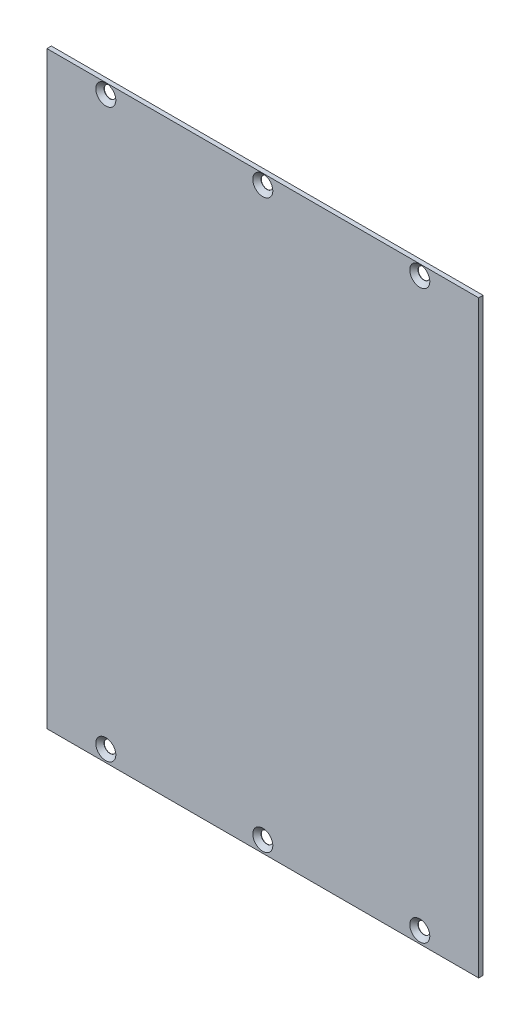
ISO-10303-21;
HEADER;
FILE_DESCRIPTION(('STEP AP214'),'2;1');
FILE_NAME('part.step','',(''),(''),'','','');
FILE_SCHEMA(('AUTOMOTIVE_DESIGN { 1 0 10303 214 1 1 1 1 }'));
ENDSEC;
DATA;
#1=APPLICATION_CONTEXT('core data for automotive mechanical design processes');
#2=APPLICATION_PROTOCOL_DEFINITION('international standard','automotive_design',2000,#1);
#3=PRODUCT_CONTEXT('',#1,'mechanical');
#4=PRODUCT('Part','Part','',(#3));
#5=PRODUCT_RELATED_PRODUCT_CATEGORY('part','',(#4));
#6=PRODUCT_DEFINITION_FORMATION('','',#4);
#7=PRODUCT_DEFINITION_CONTEXT('part definition',#1,'design');
#8=PRODUCT_DEFINITION('design','',#6,#7);
#9=PRODUCT_DEFINITION_SHAPE('','',#8);
#10=(LENGTH_UNIT() NAMED_UNIT(*) SI_UNIT(.MILLI.,.METRE.));
#11=(NAMED_UNIT(*) PLANE_ANGLE_UNIT() SI_UNIT($,.RADIAN.));
#12=(NAMED_UNIT(*) SI_UNIT($,.STERADIAN.) SOLID_ANGLE_UNIT());
#13=UNCERTAINTY_MEASURE_WITH_UNIT(LENGTH_MEASURE(1.E-05),#10,'distance_accuracy_value','');
#14=(GEOMETRIC_REPRESENTATION_CONTEXT(3) GLOBAL_UNCERTAINTY_ASSIGNED_CONTEXT((#13)) GLOBAL_UNIT_ASSIGNED_CONTEXT((#10,
#11,#12)) REPRESENTATION_CONTEXT('',''));
#15=CARTESIAN_POINT('',(0.,0.,0.));
#16=DIRECTION('',(0.,0.,1.));
#17=DIRECTION('',(1.,0.,0.));
#18=AXIS2_PLACEMENT_3D('',#15,#16,#17);
#19=CARTESIAN_POINT('',(0.,0.,1.5));
#20=DIRECTION('',(1.,0.,0.));
#21=DIRECTION('',(0.,1.,0.));
#22=AXIS2_PLACEMENT_3D('',#19,#20,#21);
#23=PLANE('',#22);
#24=DIRECTION('',(0.,-1.,0.));
#25=VECTOR('',#24,1.);
#26=CARTESIAN_POINT('',(0.,0.,0.));
#27=LINE('',#26,#25);
#28=CARTESIAN_POINT('',(0.,200.,0.));
#29=VERTEX_POINT('',#28);
#30=CARTESIAN_POINT('',(0.,0.,0.));
#31=VERTEX_POINT('',#30);
#32=EDGE_CURVE('E106',#29,#31,#27,.T.);
#33=ORIENTED_EDGE('',*,*,#32,.T.);
#34=DIRECTION('',(0.,0.,-1.));
#35=VECTOR('',#34,1.);
#36=CARTESIAN_POINT('',(0.,0.,1.5));
#37=LINE('',#36,#35);
#38=CARTESIAN_POINT('',(0.,0.,1.5));
#39=VERTEX_POINT('',#38);
#40=EDGE_CURVE('E97',#39,#31,#37,.T.);
#41=ORIENTED_EDGE('',*,*,#40,.F.);
#42=DIRECTION('',(0.,-1.,0.));
#43=VECTOR('',#42,1.);
#44=CARTESIAN_POINT('',(0.,0.,1.5));
#45=LINE('',#44,#43);
#46=CARTESIAN_POINT('',(0.,200.,1.5));
#47=VERTEX_POINT('',#46);
#48=EDGE_CURVE('E91',#47,#39,#45,.T.);
#49=ORIENTED_EDGE('',*,*,#48,.F.);
#50=DIRECTION('',(0.,0.,-1.));
#51=VECTOR('',#50,1.);
#52=CARTESIAN_POINT('',(0.,200.,1.5));
#53=LINE('',#52,#51);
#54=EDGE_CURVE('E102',#47,#29,#53,.T.);
#55=ORIENTED_EDGE('',*,*,#54,.T.);
#56=EDGE_LOOP('',(#33,#41,#49,#55));
#57=FACE_BOUND('',#56,.T.);
#58=ADVANCED_FACE('F37',(#57),#23,.F.);
#59=CARTESIAN_POINT('',(0.,0.,1.5));
#60=DIRECTION('',(0.,1.,0.));
#61=DIRECTION('',(0.,0.,1.));
#62=AXIS2_PLACEMENT_3D('',#59,#60,#61);
#63=PLANE('',#62);
#64=DIRECTION('',(1.,0.,0.));
#65=VECTOR('',#64,1.);
#66=CARTESIAN_POINT('',(0.,0.,0.));
#67=LINE('',#66,#65);
#68=CARTESIAN_POINT('',(146.6,0.,0.));
#69=VERTEX_POINT('',#68);
#70=EDGE_CURVE('E96',#31,#69,#67,.T.);
#71=ORIENTED_EDGE('',*,*,#70,.T.);
#72=DIRECTION('',(0.,0.,-1.));
#73=VECTOR('',#72,1.);
#74=CARTESIAN_POINT('',(146.6,0.,1.5));
#75=LINE('',#74,#73);
#76=CARTESIAN_POINT('',(146.6,0.,1.5));
#77=VERTEX_POINT('',#76);
#78=EDGE_CURVE('E94',#77,#69,#75,.T.);
#79=ORIENTED_EDGE('',*,*,#78,.F.);
#80=DIRECTION('',(1.,0.,0.));
#81=VECTOR('',#80,1.);
#82=CARTESIAN_POINT('',(0.,0.,1.5));
#83=LINE('',#82,#81);
#84=EDGE_CURVE('E86',#39,#77,#83,.T.);
#85=ORIENTED_EDGE('',*,*,#84,.F.);
#86=ORIENTED_EDGE('',*,*,#40,.T.);
#87=EDGE_LOOP('',(#71,#79,#85,#86));
#88=FACE_BOUND('',#87,.T.);
#89=ADVANCED_FACE('F95',(#88),#63,.F.);
#90=CARTESIAN_POINT('',(146.6,0.,1.5));
#91=DIRECTION('',(-1.,0.,0.));
#92=DIRECTION('',(0.,-1.,0.));
#93=AXIS2_PLACEMENT_3D('',#90,#91,#92);
#94=PLANE('',#93);
#95=DIRECTION('',(0.,1.,0.));
#96=VECTOR('',#95,1.);
#97=CARTESIAN_POINT('',(146.6,0.,0.));
#98=LINE('',#97,#96);
#99=CARTESIAN_POINT('',(146.6,200.,0.));
#100=VERTEX_POINT('',#99);
#101=EDGE_CURVE('E72',#69,#100,#98,.T.);
#102=ORIENTED_EDGE('',*,*,#101,.T.);
#103=DIRECTION('',(0.,0.,-1.));
#104=VECTOR('',#103,1.);
#105=CARTESIAN_POINT('',(146.6,200.,1.5));
#106=LINE('',#105,#104);
#107=CARTESIAN_POINT('',(146.6,200.,1.5));
#108=VERTEX_POINT('',#107);
#109=EDGE_CURVE('E98',#108,#100,#106,.T.);
#110=ORIENTED_EDGE('',*,*,#109,.F.);
#111=DIRECTION('',(0.,1.,0.));
#112=VECTOR('',#111,1.);
#113=CARTESIAN_POINT('',(146.6,0.,1.5));
#114=LINE('',#113,#112);
#115=EDGE_CURVE('E89',#77,#108,#114,.T.);
#116=ORIENTED_EDGE('',*,*,#115,.F.);
#117=ORIENTED_EDGE('',*,*,#78,.T.);
#118=EDGE_LOOP('',(#102,#110,#116,#117));
#119=FACE_BOUND('',#118,.T.);
#120=ADVANCED_FACE('F100',(#119),#94,.F.);
#121=CARTESIAN_POINT('',(0.,200.,1.5));
#122=DIRECTION('',(0.,-1.,0.));
#123=DIRECTION('',(0.,0.,-1.));
#124=AXIS2_PLACEMENT_3D('',#121,#122,#123);
#125=PLANE('',#124);
#126=DIRECTION('',(-1.,0.,0.));
#127=VECTOR('',#126,1.);
#128=CARTESIAN_POINT('',(0.,200.,0.));
#129=LINE('',#128,#127);
#130=EDGE_CURVE('E78',#100,#29,#129,.T.);
#131=ORIENTED_EDGE('',*,*,#130,.T.);
#132=ORIENTED_EDGE('',*,*,#54,.F.);
#133=DIRECTION('',(-1.,0.,0.));
#134=VECTOR('',#133,1.);
#135=CARTESIAN_POINT('',(0.,200.,1.5));
#136=LINE('',#135,#134);
#137=EDGE_CURVE('E55',#108,#47,#136,.T.);
#138=ORIENTED_EDGE('',*,*,#137,.F.);
#139=ORIENTED_EDGE('',*,*,#109,.T.);
#140=EDGE_LOOP('',(#131,#132,#138,#139));
#141=FACE_BOUND('',#140,.T.);
#142=ADVANCED_FACE('F257',(#141),#125,.F.);
#143=CARTESIAN_POINT('',(0.,0.,1.5));
#144=DIRECTION('',(0.,0.,-1.));
#145=DIRECTION('',(-1.,0.,0.));
#146=AXIS2_PLACEMENT_3D('',#143,#144,#145);
#147=PLANE('',#146);
#148=CARTESIAN_POINT('',(126.6,196.5,1.5));
#149=DIRECTION('',(0.,0.,-1.));
#150=DIRECTION('',(-1.,0.,0.));
#151=AXIS2_PLACEMENT_3D('',#148,#149,#150);
#152=CIRCLE('',#151,3.40000000000001);
#153=CARTESIAN_POINT('',(123.2,196.5,1.5));
#154=VERTEX_POINT('',#153);
#155=EDGE_CURVE('E134',#154,#154,#152,.T.);
#156=ORIENTED_EDGE('',*,*,#155,.T.);
#157=EDGE_LOOP('',(#156));
#158=FACE_BOUND('',#157,.T.);
#159=CARTESIAN_POINT('',(73.3,196.5,1.5));
#160=DIRECTION('',(0.,0.,-1.));
#161=DIRECTION('',(-1.,0.,0.));
#162=AXIS2_PLACEMENT_3D('',#159,#160,#161);
#163=CIRCLE('',#162,3.40000000000001);
#164=CARTESIAN_POINT('',(69.8999999999999,196.5,1.5));
#165=VERTEX_POINT('',#164);
#166=EDGE_CURVE('E131',#165,#165,#163,.T.);
#167=ORIENTED_EDGE('',*,*,#166,.T.);
#168=EDGE_LOOP('',(#167));
#169=FACE_BOUND('',#168,.T.);
#170=CARTESIAN_POINT('',(20.,196.5,1.5));
#171=DIRECTION('',(0.,0.,-1.));
#172=DIRECTION('',(-1.,0.,0.));
#173=AXIS2_PLACEMENT_3D('',#170,#171,#172);
#174=CIRCLE('',#173,3.40000000000001);
#175=CARTESIAN_POINT('',(23.4,196.5,1.5));
#176=VERTEX_POINT('',#175);
#177=EDGE_CURVE('E128',#176,#176,#174,.T.);
#178=ORIENTED_EDGE('',*,*,#177,.T.);
#179=EDGE_LOOP('',(#178));
#180=FACE_BOUND('',#179,.T.);
#181=CARTESIAN_POINT('',(126.6,4.,1.5));
#182=DIRECTION('',(0.,0.,-1.));
#183=DIRECTION('',(-1.,0.,0.));
#184=AXIS2_PLACEMENT_3D('',#181,#182,#183);
#185=CIRCLE('',#184,3.40000000000001);
#186=CARTESIAN_POINT('',(123.2,4.,1.5));
#187=VERTEX_POINT('',#186);
#188=EDGE_CURVE('E125',#187,#187,#185,.T.);
#189=ORIENTED_EDGE('',*,*,#188,.T.);
#190=EDGE_LOOP('',(#189));
#191=FACE_BOUND('',#190,.T.);
#192=CARTESIAN_POINT('',(73.3,4.,1.5));
#193=DIRECTION('',(0.,0.,-1.));
#194=DIRECTION('',(-1.,0.,0.));
#195=AXIS2_PLACEMENT_3D('',#192,#193,#194);
#196=CIRCLE('',#195,3.40000000000001);
#197=CARTESIAN_POINT('',(69.9,4.,1.5));
#198=VERTEX_POINT('',#197);
#199=EDGE_CURVE('E122',#198,#198,#196,.T.);
#200=ORIENTED_EDGE('',*,*,#199,.T.);
#201=EDGE_LOOP('',(#200));
#202=FACE_BOUND('',#201,.T.);
#203=CARTESIAN_POINT('',(20.,4.,1.5));
#204=DIRECTION('',(0.,0.,-1.));
#205=DIRECTION('',(-1.,0.,0.));
#206=AXIS2_PLACEMENT_3D('',#203,#204,#205);
#207=CIRCLE('',#206,3.40000000000001);
#208=CARTESIAN_POINT('',(16.6,4.,1.5));
#209=VERTEX_POINT('',#208);
#210=EDGE_CURVE('E119',#209,#209,#207,.T.);
#211=ORIENTED_EDGE('',*,*,#210,.T.);
#212=EDGE_LOOP('',(#211));
#213=FACE_BOUND('',#212,.T.);
#214=ORIENTED_EDGE('',*,*,#48,.T.);
#215=ORIENTED_EDGE('',*,*,#84,.T.);
#216=ORIENTED_EDGE('',*,*,#115,.T.);
#217=ORIENTED_EDGE('',*,*,#137,.T.);
#218=EDGE_LOOP('',(#214,#215,#216,#217));
#219=FACE_BOUND('',#218,.T.);
#220=ADVANCED_FACE('F87',(#158,#169,#180,#191,#202,#213,#219),#147,.F.);
#221=CARTESIAN_POINT('',(0.,0.,0.));
#222=DIRECTION('',(0.,0.,-1.));
#223=DIRECTION('',(-1.,0.,0.));
#224=AXIS2_PLACEMENT_3D('',#221,#222,#223);
#225=PLANE('',#224);
#226=CARTESIAN_POINT('',(126.6,4.,0.));
#227=DIRECTION('',(0.,0.,1.));
#228=DIRECTION('',(1.,0.,0.));
#229=AXIS2_PLACEMENT_3D('',#226,#227,#228);
#230=CIRCLE('',#229,2.00000000000002);
#231=CARTESIAN_POINT('',(128.6,4.,0.));
#232=VERTEX_POINT('',#231);
#233=EDGE_CURVE('E224',#232,#232,#230,.T.);
#234=ORIENTED_EDGE('',*,*,#233,.T.);
#235=EDGE_LOOP('',(#234));
#236=FACE_BOUND('',#235,.T.);
#237=CARTESIAN_POINT('',(73.3,196.5,0.));
#238=DIRECTION('',(0.,0.,1.));
#239=DIRECTION('',(1.,0.,0.));
#240=AXIS2_PLACEMENT_3D('',#237,#238,#239);
#241=CIRCLE('',#240,2.00000000000001);
#242=CARTESIAN_POINT('',(75.3,196.5,0.));
#243=VERTEX_POINT('',#242);
#244=EDGE_CURVE('E221',#243,#243,#241,.T.);
#245=ORIENTED_EDGE('',*,*,#244,.T.);
#246=EDGE_LOOP('',(#245));
#247=FACE_BOUND('',#246,.T.);
#248=CARTESIAN_POINT('',(73.3,4.,0.));
#249=DIRECTION('',(0.,0.,1.));
#250=DIRECTION('',(1.,0.,0.));
#251=AXIS2_PLACEMENT_3D('',#248,#249,#250);
#252=CIRCLE('',#251,2.);
#253=CARTESIAN_POINT('',(75.3,4.,0.));
#254=VERTEX_POINT('',#253);
#255=EDGE_CURVE('E216',#254,#254,#252,.T.);
#256=ORIENTED_EDGE('',*,*,#255,.T.);
#257=EDGE_LOOP('',(#256));
#258=FACE_BOUND('',#257,.T.);
#259=CARTESIAN_POINT('',(20.,196.5,0.));
#260=DIRECTION('',(0.,0.,1.));
#261=DIRECTION('',(1.,0.,0.));
#262=AXIS2_PLACEMENT_3D('',#259,#260,#261);
#263=CIRCLE('',#262,2.);
#264=CARTESIAN_POINT('',(22.,196.5,0.));
#265=VERTEX_POINT('',#264);
#266=EDGE_CURVE('E214',#265,#265,#263,.T.);
#267=ORIENTED_EDGE('',*,*,#266,.T.);
#268=EDGE_LOOP('',(#267));
#269=FACE_BOUND('',#268,.T.);
#270=CARTESIAN_POINT('',(126.6,196.5,0.));
#271=DIRECTION('',(0.,0.,1.));
#272=DIRECTION('',(1.,0.,0.));
#273=AXIS2_PLACEMENT_3D('',#270,#271,#272);
#274=CIRCLE('',#273,2.);
#275=CARTESIAN_POINT('',(128.6,196.5,0.));
#276=VERTEX_POINT('',#275);
#277=EDGE_CURVE('E227',#276,#276,#274,.T.);
#278=ORIENTED_EDGE('',*,*,#277,.T.);
#279=EDGE_LOOP('',(#278));
#280=FACE_BOUND('',#279,.T.);
#281=CARTESIAN_POINT('',(20.,4.,0.));
#282=DIRECTION('',(0.,0.,1.));
#283=DIRECTION('',(1.,0.,0.));
#284=AXIS2_PLACEMENT_3D('',#281,#282,#283);
#285=CIRCLE('',#284,2.);
#286=CARTESIAN_POINT('',(22.,4.,0.));
#287=VERTEX_POINT('',#286);
#288=EDGE_CURVE('E109',#287,#287,#285,.T.);
#289=ORIENTED_EDGE('',*,*,#288,.T.);
#290=EDGE_LOOP('',(#289));
#291=FACE_BOUND('',#290,.T.);
#292=ORIENTED_EDGE('',*,*,#32,.F.);
#293=ORIENTED_EDGE('',*,*,#130,.F.);
#294=ORIENTED_EDGE('',*,*,#101,.F.);
#295=ORIENTED_EDGE('',*,*,#70,.F.);
#296=EDGE_LOOP('',(#292,#293,#294,#295));
#297=FACE_BOUND('',#296,.T.);
#298=ADVANCED_FACE('F233',(#236,#247,#258,#269,#280,#291,#297),#225,.T.);
#299=CARTESIAN_POINT('',(20.,4.,0.));
#300=DIRECTION('',(0.,0.,1.));
#301=DIRECTION('',(1.,0.,0.));
#302=AXIS2_PLACEMENT_3D('',#299,#300,#301);
#303=CYLINDRICAL_SURFACE('',#302,2.);
#304=CARTESIAN_POINT('',(20.,4.,0.100000000000006));
#305=DIRECTION('',(0.,0.,-1.));
#306=DIRECTION('',(-1.,0.,0.));
#307=AXIS2_PLACEMENT_3D('',#304,#305,#306);
#308=CIRCLE('',#307,2.);
#309=CARTESIAN_POINT('',(18.,4.,0.100000000000006));
#310=VERTEX_POINT('',#309);
#311=EDGE_CURVE('E11',#310,#310,#308,.F.);
#312=ORIENTED_EDGE('',*,*,#311,.T.);
#313=EDGE_LOOP('',(#312));
#314=FACE_BOUND('',#313,.T.);
#315=ORIENTED_EDGE('',*,*,#288,.F.);
#316=EDGE_LOOP('',(#315));
#317=FACE_BOUND('',#316,.T.);
#318=ADVANCED_FACE('F237',(#314,#317),#303,.F.);
#319=CARTESIAN_POINT('',(126.6,196.5,0.));
#320=DIRECTION('',(0.,0.,1.));
#321=DIRECTION('',(1.,0.,0.));
#322=AXIS2_PLACEMENT_3D('',#319,#320,#321);
#323=CYLINDRICAL_SURFACE('',#322,2.);
#324=CARTESIAN_POINT('',(126.6,196.5,0.100000000000003));
#325=DIRECTION('',(0.,0.,-1.));
#326=DIRECTION('',(-1.,0.,0.));
#327=AXIS2_PLACEMENT_3D('',#324,#325,#326);
#328=CIRCLE('',#327,2.);
#329=CARTESIAN_POINT('',(124.6,196.5,0.100000000000003));
#330=VERTEX_POINT('',#329);
#331=EDGE_CURVE('E116',#330,#330,#328,.F.);
#332=ORIENTED_EDGE('',*,*,#331,.T.);
#333=EDGE_LOOP('',(#332));
#334=FACE_BOUND('',#333,.T.);
#335=ORIENTED_EDGE('',*,*,#277,.F.);
#336=EDGE_LOOP('',(#335));
#337=FACE_BOUND('',#336,.T.);
#338=ADVANCED_FACE('F210',(#334,#337),#323,.F.);
#339=CARTESIAN_POINT('',(20.,196.5,0.));
#340=DIRECTION('',(0.,0.,1.));
#341=DIRECTION('',(1.,0.,0.));
#342=AXIS2_PLACEMENT_3D('',#339,#340,#341);
#343=CYLINDRICAL_SURFACE('',#342,2.);
#344=CARTESIAN_POINT('',(20.,196.5,0.10000000000001));
#345=DIRECTION('',(0.,0.,-1.));
#346=DIRECTION('',(-1.,0.,0.));
#347=AXIS2_PLACEMENT_3D('',#344,#345,#346);
#348=CIRCLE('',#347,2.);
#349=CARTESIAN_POINT('',(22.,196.5,0.10000000000001));
#350=VERTEX_POINT('',#349);
#351=EDGE_CURVE('E140',#350,#350,#348,.F.);
#352=ORIENTED_EDGE('',*,*,#351,.T.);
#353=EDGE_LOOP('',(#352));
#354=FACE_BOUND('',#353,.T.);
#355=ORIENTED_EDGE('',*,*,#266,.F.);
#356=EDGE_LOOP('',(#355));
#357=FACE_BOUND('',#356,.T.);
#358=ADVANCED_FACE('F207',(#354,#357),#343,.F.);
#359=CARTESIAN_POINT('',(73.3,4.,0.));
#360=DIRECTION('',(0.,0.,1.));
#361=DIRECTION('',(1.,0.,0.));
#362=AXIS2_PLACEMENT_3D('',#359,#360,#361);
#363=CYLINDRICAL_SURFACE('',#362,2.);
#364=CARTESIAN_POINT('',(73.3,4.,0.100000000000003));
#365=DIRECTION('',(0.,0.,-1.));
#366=DIRECTION('',(-1.,0.,0.));
#367=AXIS2_PLACEMENT_3D('',#364,#365,#366);
#368=CIRCLE('',#367,2.);
#369=CARTESIAN_POINT('',(71.3,4.,0.100000000000003));
#370=VERTEX_POINT('',#369);
#371=EDGE_CURVE('E47',#370,#370,#368,.F.);
#372=ORIENTED_EDGE('',*,*,#371,.T.);
#373=EDGE_LOOP('',(#372));
#374=FACE_BOUND('',#373,.T.);
#375=ORIENTED_EDGE('',*,*,#255,.F.);
#376=EDGE_LOOP('',(#375));
#377=FACE_BOUND('',#376,.T.);
#378=ADVANCED_FACE('F148',(#374,#377),#363,.F.);
#379=CARTESIAN_POINT('',(73.3,196.5,0.));
#380=DIRECTION('',(0.,0.,1.));
#381=DIRECTION('',(1.,0.,0.));
#382=AXIS2_PLACEMENT_3D('',#379,#380,#381);
#383=CYLINDRICAL_SURFACE('',#382,2.00000000000001);
#384=CARTESIAN_POINT('',(73.3,196.5,0.100000000000017));
#385=DIRECTION('',(0.,0.,-1.));
#386=DIRECTION('',(-1.,0.,0.));
#387=AXIS2_PLACEMENT_3D('',#384,#385,#386);
#388=CIRCLE('',#387,2.00000000000001);
#389=CARTESIAN_POINT('',(71.2999999999999,196.5,0.100000000000017));
#390=VERTEX_POINT('',#389);
#391=EDGE_CURVE('E137',#390,#390,#388,.F.);
#392=ORIENTED_EDGE('',*,*,#391,.T.);
#393=EDGE_LOOP('',(#392));
#394=FACE_BOUND('',#393,.T.);
#395=ORIENTED_EDGE('',*,*,#244,.F.);
#396=EDGE_LOOP('',(#395));
#397=FACE_BOUND('',#396,.T.);
#398=ADVANCED_FACE('F246',(#394,#397),#383,.F.);
#399=CARTESIAN_POINT('',(126.6,4.,0.));
#400=DIRECTION('',(0.,0.,1.));
#401=DIRECTION('',(1.,0.,0.));
#402=AXIS2_PLACEMENT_3D('',#399,#400,#401);
#403=CYLINDRICAL_SURFACE('',#402,2.00000000000002);
#404=CARTESIAN_POINT('',(126.6,4.,0.100000000000029));
#405=DIRECTION('',(0.,0.,-1.));
#406=DIRECTION('',(-1.,0.,0.));
#407=AXIS2_PLACEMENT_3D('',#404,#405,#406);
#408=CIRCLE('',#407,2.00000000000002);
#409=CARTESIAN_POINT('',(124.6,4.,0.100000000000029));
#410=VERTEX_POINT('',#409);
#411=EDGE_CURVE('E143',#410,#410,#408,.F.);
#412=ORIENTED_EDGE('',*,*,#411,.T.);
#413=EDGE_LOOP('',(#412));
#414=FACE_BOUND('',#413,.T.);
#415=ORIENTED_EDGE('',*,*,#233,.F.);
#416=EDGE_LOOP('',(#415));
#417=FACE_BOUND('',#416,.T.);
#418=ADVANCED_FACE('F182',(#414,#417),#403,.F.);
#419=CARTESIAN_POINT('',(126.6,196.5,0.100000000000002));
#420=DIRECTION('',(0.,0.,1.));
#421=DIRECTION('',(1.,0.,0.));
#422=AXIS2_PLACEMENT_3D('',#419,#420,#421);
#423=CONICAL_SURFACE('',#422,2.,0.78539816339746);
#424=ORIENTED_EDGE('',*,*,#155,.F.);
#425=EDGE_LOOP('',(#424));
#426=FACE_BOUND('',#425,.T.);
#427=ORIENTED_EDGE('',*,*,#331,.F.);
#428=EDGE_LOOP('',(#427));
#429=FACE_BOUND('',#428,.T.);
#430=ADVANCED_FACE('F175',(#426,#429),#423,.F.);
#431=CARTESIAN_POINT('',(73.3,196.5,0.100000000000016));
#432=DIRECTION('',(0.,0.,1.));
#433=DIRECTION('',(1.,0.,0.));
#434=AXIS2_PLACEMENT_3D('',#431,#432,#433);
#435=CONICAL_SURFACE('',#434,2.00000000000001,0.785398163397456);
#436=ORIENTED_EDGE('',*,*,#166,.F.);
#437=EDGE_LOOP('',(#436));
#438=FACE_BOUND('',#437,.T.);
#439=ORIENTED_EDGE('',*,*,#391,.F.);
#440=EDGE_LOOP('',(#439));
#441=FACE_BOUND('',#440,.T.);
#442=ADVANCED_FACE('F181',(#438,#441),#435,.F.);
#443=CARTESIAN_POINT('',(20.,196.5,0.10000000000001));
#444=DIRECTION('',(0.,0.,1.));
#445=DIRECTION('',(1.,0.,0.));
#446=AXIS2_PLACEMENT_3D('',#443,#444,#445);
#447=CONICAL_SURFACE('',#446,2.,0.785398163397456);
#448=CARTESIAN_POINT('',(23.4,196.5,1.5));
#449=CARTESIAN_POINT('',(23.3854166666666,196.5,1.48541666666667));
#450=CARTESIAN_POINT('',(23.3708333333333,196.5,1.47083333333333));
#451=CARTESIAN_POINT('',(23.3416666666666,196.5,1.44166666666667));
#452=CARTESIAN_POINT('',(23.3270833333333,196.5,1.42708333333333));
#453=CARTESIAN_POINT('',(23.2979166666666,196.5,1.39791666666667));
#454=CARTESIAN_POINT('',(23.2833333333333,196.5,1.38333333333333));
#455=CARTESIAN_POINT('',(23.2541666666666,196.5,1.35416666666667));
#456=CARTESIAN_POINT('',(23.2395833333333,196.5,1.33958333333333));
#457=CARTESIAN_POINT('',(23.2104166666666,196.5,1.31041666666667));
#458=CARTESIAN_POINT('',(23.1958333333333,196.5,1.29583333333333));
#459=CARTESIAN_POINT('',(23.1666666666666,196.5,1.26666666666667));
#460=CARTESIAN_POINT('',(23.1520833333333,196.5,1.25208333333334));
#461=CARTESIAN_POINT('',(23.1229166666666,196.5,1.22291666666667));
#462=CARTESIAN_POINT('',(23.1083333333333,196.5,1.20833333333334));
#463=CARTESIAN_POINT('',(23.0791666666666,196.5,1.17916666666667));
#464=CARTESIAN_POINT('',(23.0645833333333,196.5,1.16458333333334));
#465=CARTESIAN_POINT('',(23.0354166666666,196.5,1.13541666666667));
#466=CARTESIAN_POINT('',(23.0208333333333,196.5,1.12083333333334));
#467=CARTESIAN_POINT('',(22.9916666666666,196.5,1.09166666666667));
#468=CARTESIAN_POINT('',(22.9770833333333,196.5,1.07708333333334));
#469=CARTESIAN_POINT('',(22.9479166666666,196.5,1.04791666666667));
#470=CARTESIAN_POINT('',(22.9333333333333,196.5,1.03333333333334));
#471=CARTESIAN_POINT('',(22.9041666666666,196.5,1.00416666666667));
#472=CARTESIAN_POINT('',(22.8895833333333,196.5,0.989583333333337));
#473=CARTESIAN_POINT('',(22.8604166666666,196.5,0.960416666666671));
#474=CARTESIAN_POINT('',(22.8458333333333,196.5,0.945833333333337));
#475=CARTESIAN_POINT('',(22.8166666666666,196.5,0.916666666666671));
#476=CARTESIAN_POINT('',(22.8020833333333,196.5,0.902083333333338));
#477=CARTESIAN_POINT('',(22.7729166666666,196.5,0.872916666666672));
#478=CARTESIAN_POINT('',(22.7583333333333,196.5,0.858333333333338));
#479=CARTESIAN_POINT('',(22.7291666666666,196.5,0.829166666666671));
#480=CARTESIAN_POINT('',(22.7145833333333,196.5,0.814583333333339));
#481=CARTESIAN_POINT('',(22.6854166666666,196.5,0.785416666666672));
#482=CARTESIAN_POINT('',(22.6708333333333,196.5,0.770833333333338));
#483=CARTESIAN_POINT('',(22.6416666666666,196.5,0.741666666666672));
#484=CARTESIAN_POINT('',(22.6270833333333,196.5,0.727083333333339));
#485=CARTESIAN_POINT('',(22.5979166666666,196.5,0.697916666666673));
#486=CARTESIAN_POINT('',(22.5833333333333,196.5,0.683333333333339));
#487=CARTESIAN_POINT('',(22.5541666666666,196.5,0.654166666666672));
#488=CARTESIAN_POINT('',(22.5395833333333,196.5,0.63958333333334));
#489=CARTESIAN_POINT('',(22.5104166666666,196.5,0.610416666666673));
#490=CARTESIAN_POINT('',(22.4958333333333,196.5,0.595833333333339));
#491=CARTESIAN_POINT('',(22.4666666666666,196.5,0.566666666666673));
#492=CARTESIAN_POINT('',(22.4520833333333,196.5,0.55208333333334));
#493=CARTESIAN_POINT('',(22.4229166666666,196.5,0.522916666666674));
#494=CARTESIAN_POINT('',(22.4083333333333,196.5,0.50833333333334));
#495=CARTESIAN_POINT('',(22.3791666666666,196.5,0.479166666666674));
#496=CARTESIAN_POINT('',(22.3645833333333,196.5,0.464583333333341));
#497=CARTESIAN_POINT('',(22.3354166666666,196.5,0.435416666666674));
#498=CARTESIAN_POINT('',(22.3208333333333,196.5,0.420833333333341));
#499=CARTESIAN_POINT('',(22.2916666666666,196.5,0.391666666666674));
#500=CARTESIAN_POINT('',(22.2770833333333,196.5,0.377083333333341));
#501=CARTESIAN_POINT('',(22.2479166666666,196.5,0.347916666666675));
#502=CARTESIAN_POINT('',(22.2333333333333,196.5,0.333333333333341));
#503=CARTESIAN_POINT('',(22.2041666666666,196.5,0.304166666666675));
#504=CARTESIAN_POINT('',(22.1895833333333,196.5,0.289583333333342));
#505=CARTESIAN_POINT('',(22.1604166666666,196.5,0.260416666666676));
#506=CARTESIAN_POINT('',(22.1458333333333,196.5,0.245833333333342));
#507=CARTESIAN_POINT('',(22.1166666666666,196.5,0.216666666666676));
#508=CARTESIAN_POINT('',(22.1020833333333,196.5,0.202083333333342));
#509=CARTESIAN_POINT('',(22.0729166666666,196.5,0.172916666666676));
#510=CARTESIAN_POINT('',(22.0583333333333,196.5,0.158333333333343));
#511=CARTESIAN_POINT('',(22.0291666666666,196.5,0.129166666666676));
#512=CARTESIAN_POINT('',(22.0145833333333,196.5,0.114583333333343));
#513=CARTESIAN_POINT('',(22.,196.5,0.10000000000001));
#514=B_SPLINE_CURVE_WITH_KNOTS('',3,(#448,#449,#450,#451,#452,#453,#454,#455,#456,#457,#458,
#459,#460,#461,#462,#463,#464,#465,#466,#467,#468,#469,#470,#471,#472,#473,#474,#475,#476,#477,
#478,#479,#480,#481,#482,#483,#484,#485,#486,#487,#488,#489,#490,#491,#492,#493,#494,#495,#496,
#497,#498,#499,#500,#501,#502,#503,#504,#505,#506,#507,#508,#509,#510,#511,#512,#513),
.UNSPECIFIED.,.F.,.F.,(4,2,2,2,2,2,2,2,2,2,2,2,2,2,2,2,2,2,2,2,2,2,2,2,2,2,2,2,2,2,2,2,4),(0.,
0.0618718433538218,0.123743686707646,0.185615530061468,0.247487373415292,0.309359216769114,
0.371231060122938,0.43310290347676,0.494974746830584,0.556846590184406,0.61871843353823,
0.680590276892051,0.742462120245875,0.804333963599697,0.866205806953521,0.928077650307343,
0.989949493661167,1.05182133701499,1.11369318036881,1.17556502372264,1.23743686707646,
1.29930871043028,1.36118055378411,1.42305239713793,1.48492424049175,1.54679608384557,
1.6086679271994,1.67053977055322,1.73241161390704,1.79428345726086,1.85615530061469,
1.91802714396851,1.97989898732233),.UNSPECIFIED.);
#515=EDGE_CURVE('BSEAM160',#176,#350,#514,.T.);
#516=ORIENTED_EDGE('',*,*,#177,.F.);
#517=ORIENTED_EDGE('',*,*,#351,.F.);
#518=ORIENTED_EDGE('',*,*,#515,.T.);
#519=ORIENTED_EDGE('',*,*,#515,.F.);
#520=EDGE_LOOP('',(#516,#518,#517,#519));
#521=FACE_BOUND('',#520,.T.);
#522=ADVANCED_FACE('F160',(#521),#447,.F.);
#523=CARTESIAN_POINT('',(126.6,4.,0.100000000000029));
#524=DIRECTION('',(0.,0.,1.));
#525=DIRECTION('',(1.,0.,0.));
#526=AXIS2_PLACEMENT_3D('',#523,#524,#525);
#527=CONICAL_SURFACE('',#526,2.00000000000002,0.78539816339745);
#528=ORIENTED_EDGE('',*,*,#188,.F.);
#529=EDGE_LOOP('',(#528));
#530=FACE_BOUND('',#529,.T.);
#531=ORIENTED_EDGE('',*,*,#411,.F.);
#532=EDGE_LOOP('',(#531));
#533=FACE_BOUND('',#532,.T.);
#534=ADVANCED_FACE('F153',(#530,#533),#527,.F.);
#535=CARTESIAN_POINT('',(73.3,4.,0.100000000000002));
#536=DIRECTION('',(0.,0.,1.));
#537=DIRECTION('',(1.,0.,0.));
#538=AXIS2_PLACEMENT_3D('',#535,#536,#537);
#539=CONICAL_SURFACE('',#538,2.,0.785398163397456);
#540=ORIENTED_EDGE('',*,*,#199,.F.);
#541=EDGE_LOOP('',(#540));
#542=FACE_BOUND('',#541,.T.);
#543=ORIENTED_EDGE('',*,*,#371,.F.);
#544=EDGE_LOOP('',(#543));
#545=FACE_BOUND('',#544,.T.);
#546=ADVANCED_FACE('F151',(#542,#545),#539,.F.);
#547=CARTESIAN_POINT('',(20.,4.,0.100000000000006));
#548=DIRECTION('',(0.,0.,1.));
#549=DIRECTION('',(1.,0.,0.));
#550=AXIS2_PLACEMENT_3D('',#547,#548,#549);
#551=CONICAL_SURFACE('',#550,2.,0.785398163397456);
#552=ORIENTED_EDGE('',*,*,#210,.F.);
#553=EDGE_LOOP('',(#552));
#554=FACE_BOUND('',#553,.T.);
#555=ORIENTED_EDGE('',*,*,#311,.F.);
#556=EDGE_LOOP('',(#555));
#557=FACE_BOUND('',#556,.T.);
#558=ADVANCED_FACE('F40',(#554,#557),#551,.F.);
#559=CLOSED_SHELL('',(#58,#89,#120,#142,#220,#298,#318,#338,#358,#378,#398,#418,#430,#442,#522,
#534,#546,#558));
#560=MANIFOLD_SOLID_BREP('B2',#559);
#561=ADVANCED_BREP_SHAPE_REPRESENTATION('',(#18,#560),#14);
#562=SHAPE_DEFINITION_REPRESENTATION(#9,#561);
ENDSEC;
END-ISO-10303-21;
